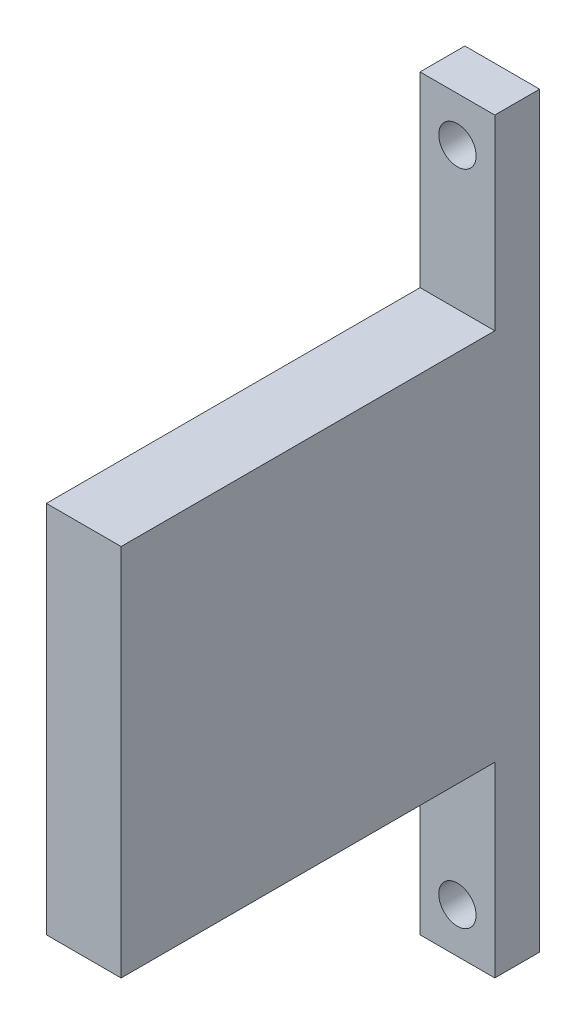
ISO-10303-21;
HEADER;
FILE_DESCRIPTION(('STEP AP214'),'2;1');
FILE_NAME('part.step','',(''),(''),'','','');
FILE_SCHEMA(('AUTOMOTIVE_DESIGN { 1 0 10303 214 1 1 1 1 }'));
ENDSEC;
DATA;
#1=APPLICATION_CONTEXT('core data for automotive mechanical design processes');
#2=APPLICATION_PROTOCOL_DEFINITION('international standard','automotive_design',2000,#1);
#3=PRODUCT_CONTEXT('',#1,'mechanical');
#4=PRODUCT('Part','Part','',(#3));
#5=PRODUCT_RELATED_PRODUCT_CATEGORY('part','',(#4));
#6=PRODUCT_DEFINITION_FORMATION('','',#4);
#7=PRODUCT_DEFINITION_CONTEXT('part definition',#1,'design');
#8=PRODUCT_DEFINITION('design','',#6,#7);
#9=PRODUCT_DEFINITION_SHAPE('','',#8);
#10=(LENGTH_UNIT() NAMED_UNIT(*) SI_UNIT(.MILLI.,.METRE.));
#11=(NAMED_UNIT(*) PLANE_ANGLE_UNIT() SI_UNIT($,.RADIAN.));
#12=(NAMED_UNIT(*) SI_UNIT($,.STERADIAN.) SOLID_ANGLE_UNIT());
#13=UNCERTAINTY_MEASURE_WITH_UNIT(LENGTH_MEASURE(1.E-05),#10,'distance_accuracy_value','');
#14=(GEOMETRIC_REPRESENTATION_CONTEXT(3) GLOBAL_UNCERTAINTY_ASSIGNED_CONTEXT((#13)) GLOBAL_UNIT_ASSIGNED_CONTEXT((#10,
#11,#12)) REPRESENTATION_CONTEXT('',''));
#15=CARTESIAN_POINT('',(0.,0.,0.));
#16=DIRECTION('',(0.,0.,1.));
#17=DIRECTION('',(1.,0.,0.));
#18=AXIS2_PLACEMENT_3D('',#15,#16,#17);
#19=CARTESIAN_POINT('',(5.,0.,0.));
#20=DIRECTION('',(0.,0.,-1.));
#21=DIRECTION('',(-1.,0.,0.));
#22=AXIS2_PLACEMENT_3D('',#19,#20,#21);
#23=PLANE('',#22);
#24=DIRECTION('',(0.,-1.,0.));
#25=VECTOR('',#24,1.);
#26=CARTESIAN_POINT('',(0.,0.,0.));
#27=LINE('',#26,#25);
#28=CARTESIAN_POINT('',(0.,25.,0.));
#29=VERTEX_POINT('',#28);
#30=CARTESIAN_POINT('',(0.,0.,0.));
#31=VERTEX_POINT('',#30);
#32=EDGE_CURVE('E148',#29,#31,#27,.T.);
#33=ORIENTED_EDGE('',*,*,#32,.T.);
#34=DIRECTION('',(-1.,0.,0.));
#35=VECTOR('',#34,1.);
#36=CARTESIAN_POINT('',(5.,0.,0.));
#37=LINE('',#36,#35);
#38=CARTESIAN_POINT('',(5.,0.,0.));
#39=VERTEX_POINT('',#38);
#40=EDGE_CURVE('E176',#39,#31,#37,.T.);
#41=ORIENTED_EDGE('',*,*,#40,.F.);
#42=DIRECTION('',(0.,-1.,0.));
#43=VECTOR('',#42,1.);
#44=CARTESIAN_POINT('',(5.,0.,0.));
#45=LINE('',#44,#43);
#46=CARTESIAN_POINT('',(5.,25.,0.));
#47=VERTEX_POINT('',#46);
#48=EDGE_CURVE('E163',#47,#39,#45,.T.);
#49=ORIENTED_EDGE('',*,*,#48,.F.);
#50=DIRECTION('',(-1.,0.,0.));
#51=VECTOR('',#50,1.);
#52=CARTESIAN_POINT('',(5.,25.,0.));
#53=LINE('',#52,#51);
#54=EDGE_CURVE('E144',#47,#29,#53,.T.);
#55=ORIENTED_EDGE('',*,*,#54,.T.);
#56=EDGE_LOOP('',(#33,#41,#49,#55));
#57=FACE_BOUND('',#56,.T.);
#58=ADVANCED_FACE('F49',(#57),#23,.F.);
#59=CARTESIAN_POINT('',(5.,0.,0.));
#60=DIRECTION('',(0.,1.,0.));
#61=DIRECTION('',(0.,0.,1.));
#62=AXIS2_PLACEMENT_3D('',#59,#60,#61);
#63=PLANE('',#62);
#64=DIRECTION('',(0.,0.,-1.));
#65=VECTOR('',#64,1.);
#66=CARTESIAN_POINT('',(0.,0.,0.));
#67=LINE('',#66,#65);
#68=CARTESIAN_POINT('',(0.,0.,-25.));
#69=VERTEX_POINT('',#68);
#70=EDGE_CURVE('E151',#31,#69,#67,.T.);
#71=ORIENTED_EDGE('',*,*,#70,.T.);
#72=DIRECTION('',(-1.,0.,0.));
#73=VECTOR('',#72,1.);
#74=CARTESIAN_POINT('',(5.,0.,-25.));
#75=LINE('',#74,#73);
#76=CARTESIAN_POINT('',(5.,0.,-25.));
#77=VERTEX_POINT('',#76);
#78=EDGE_CURVE('E173',#77,#69,#75,.T.);
#79=ORIENTED_EDGE('',*,*,#78,.F.);
#80=DIRECTION('',(0.,0.,-1.));
#81=VECTOR('',#80,1.);
#82=CARTESIAN_POINT('',(5.,0.,0.));
#83=LINE('',#82,#81);
#84=EDGE_CURVE('E111',#39,#77,#83,.T.);
#85=ORIENTED_EDGE('',*,*,#84,.F.);
#86=ORIENTED_EDGE('',*,*,#40,.T.);
#87=EDGE_LOOP('',(#71,#79,#85,#86));
#88=FACE_BOUND('',#87,.T.);
#89=ADVANCED_FACE('F197',(#88),#63,.F.);
#90=CARTESIAN_POINT('',(5.,-12.5,-25.));
#91=DIRECTION('',(0.,0.,-1.));
#92=DIRECTION('',(-1.,0.,0.));
#93=AXIS2_PLACEMENT_3D('',#90,#91,#92);
#94=PLANE('',#93);
#95=CARTESIAN_POINT('',(2.5,-9.5,-25.));
#96=DIRECTION('',(0.,0.,1.));
#97=DIRECTION('',(-1.,0.,0.));
#98=AXIS2_PLACEMENT_3D('',#95,#96,#97);
#99=CIRCLE('',#98,1.25);
#100=CARTESIAN_POINT('',(1.25,-9.5,-25.));
#101=VERTEX_POINT('',#100);
#102=EDGE_CURVE('E327',#101,#101,#99,.T.);
#103=ORIENTED_EDGE('',*,*,#102,.F.);
#104=EDGE_LOOP('',(#103));
#105=FACE_BOUND('',#104,.T.);
#106=DIRECTION('',(0.,-1.,0.));
#107=VECTOR('',#106,1.);
#108=CARTESIAN_POINT('',(0.,-12.5,-25.));
#109=LINE('',#108,#107);
#110=CARTESIAN_POINT('',(0.,-12.5,-25.));
#111=VERTEX_POINT('',#110);
#112=EDGE_CURVE('E154',#69,#111,#109,.T.);
#113=ORIENTED_EDGE('',*,*,#112,.T.);
#114=DIRECTION('',(-1.,0.,0.));
#115=VECTOR('',#114,1.);
#116=CARTESIAN_POINT('',(5.,-12.5,-25.));
#117=LINE('',#116,#115);
#118=CARTESIAN_POINT('',(5.,-12.5,-25.));
#119=VERTEX_POINT('',#118);
#120=EDGE_CURVE('E170',#119,#111,#117,.T.);
#121=ORIENTED_EDGE('',*,*,#120,.F.);
#122=DIRECTION('',(0.,-1.,0.));
#123=VECTOR('',#122,1.);
#124=CARTESIAN_POINT('',(5.,-12.5,-25.));
#125=LINE('',#124,#123);
#126=EDGE_CURVE('E333',#77,#119,#125,.T.);
#127=ORIENTED_EDGE('',*,*,#126,.F.);
#128=ORIENTED_EDGE('',*,*,#78,.T.);
#129=EDGE_LOOP('',(#113,#121,#127,#128));
#130=FACE_BOUND('',#129,.T.);
#131=ADVANCED_FACE('F202',(#105,#130),#94,.F.);
#132=CARTESIAN_POINT('',(5.,-12.5,-25.));
#133=DIRECTION('',(0.,1.,0.));
#134=DIRECTION('',(0.,0.,1.));
#135=AXIS2_PLACEMENT_3D('',#132,#133,#134);
#136=PLANE('',#135);
#137=DIRECTION('',(0.,0.,-1.));
#138=VECTOR('',#137,1.);
#139=CARTESIAN_POINT('',(0.,-12.5,-25.));
#140=LINE('',#139,#138);
#141=CARTESIAN_POINT('',(0.,-12.5,-28.));
#142=VERTEX_POINT('',#141);
#143=EDGE_CURVE('E156',#111,#142,#140,.T.);
#144=ORIENTED_EDGE('',*,*,#143,.T.);
#145=DIRECTION('',(-1.,0.,0.));
#146=VECTOR('',#145,1.);
#147=CARTESIAN_POINT('',(5.,-12.5,-28.));
#148=LINE('',#147,#146);
#149=CARTESIAN_POINT('',(5.,-12.5,-28.));
#150=VERTEX_POINT('',#149);
#151=EDGE_CURVE('E167',#150,#142,#148,.T.);
#152=ORIENTED_EDGE('',*,*,#151,.F.);
#153=DIRECTION('',(0.,0.,-1.));
#154=VECTOR('',#153,1.);
#155=CARTESIAN_POINT('',(5.,-12.5,-25.));
#156=LINE('',#155,#154);
#157=EDGE_CURVE('E335',#119,#150,#156,.T.);
#158=ORIENTED_EDGE('',*,*,#157,.F.);
#159=ORIENTED_EDGE('',*,*,#120,.T.);
#160=EDGE_LOOP('',(#144,#152,#158,#159));
#161=FACE_BOUND('',#160,.T.);
#162=ADVANCED_FACE('F207',(#161),#136,.F.);
#163=CARTESIAN_POINT('',(5.,-12.5,-28.));
#164=DIRECTION('',(0.,0.,1.));
#165=DIRECTION('',(1.,0.,0.));
#166=AXIS2_PLACEMENT_3D('',#163,#164,#165);
#167=PLANE('',#166);
#168=CARTESIAN_POINT('',(2.5,34.5,-28.));
#169=DIRECTION('',(0.,0.,1.));
#170=DIRECTION('',(1.,0.,0.));
#171=AXIS2_PLACEMENT_3D('',#168,#169,#170);
#172=CIRCLE('',#171,1.25);
#173=CARTESIAN_POINT('',(3.75,34.5,-28.));
#174=VERTEX_POINT('',#173);
#175=EDGE_CURVE('E179',#174,#174,#172,.T.);
#176=ORIENTED_EDGE('',*,*,#175,.T.);
#177=EDGE_LOOP('',(#176));
#178=FACE_BOUND('',#177,.T.);
#179=CARTESIAN_POINT('',(2.5,-9.5,-28.));
#180=DIRECTION('',(0.,0.,1.));
#181=DIRECTION('',(1.,0.,0.));
#182=AXIS2_PLACEMENT_3D('',#179,#180,#181);
#183=CIRCLE('',#182,1.25);
#184=CARTESIAN_POINT('',(3.75,-9.5,-28.));
#185=VERTEX_POINT('',#184);
#186=EDGE_CURVE('E152',#185,#185,#183,.T.);
#187=ORIENTED_EDGE('',*,*,#186,.T.);
#188=EDGE_LOOP('',(#187));
#189=FACE_BOUND('',#188,.T.);
#190=DIRECTION('',(0.,1.,0.));
#191=VECTOR('',#190,1.);
#192=CARTESIAN_POINT('',(0.,-12.5,-28.));
#193=LINE('',#192,#191);
#194=CARTESIAN_POINT('',(0.,37.5,-28.));
#195=VERTEX_POINT('',#194);
#196=EDGE_CURVE('E158',#142,#195,#193,.T.);
#197=ORIENTED_EDGE('',*,*,#196,.T.);
#198=DIRECTION('',(-1.,0.,0.));
#199=VECTOR('',#198,1.);
#200=CARTESIAN_POINT('',(5.,37.5,-28.));
#201=LINE('',#200,#199);
#202=CARTESIAN_POINT('',(5.,37.5,-28.));
#203=VERTEX_POINT('',#202);
#204=EDGE_CURVE('E139',#203,#195,#201,.T.);
#205=ORIENTED_EDGE('',*,*,#204,.F.);
#206=DIRECTION('',(0.,1.,0.));
#207=VECTOR('',#206,1.);
#208=CARTESIAN_POINT('',(5.,-12.5,-28.));
#209=LINE('',#208,#207);
#210=EDGE_CURVE('E130',#150,#203,#209,.T.);
#211=ORIENTED_EDGE('',*,*,#210,.F.);
#212=ORIENTED_EDGE('',*,*,#151,.T.);
#213=EDGE_LOOP('',(#197,#205,#211,#212));
#214=FACE_BOUND('',#213,.T.);
#215=ADVANCED_FACE('F211',(#178,#189,#214),#167,.F.);
#216=CARTESIAN_POINT('',(5.,37.5,-25.));
#217=DIRECTION('',(0.,-1.,0.));
#218=DIRECTION('',(0.,0.,-1.));
#219=AXIS2_PLACEMENT_3D('',#216,#217,#218);
#220=PLANE('',#219);
#221=DIRECTION('',(0.,0.,1.));
#222=VECTOR('',#221,1.);
#223=CARTESIAN_POINT('',(0.,37.5,-25.));
#224=LINE('',#223,#222);
#225=CARTESIAN_POINT('',(0.,37.5,-25.));
#226=VERTEX_POINT('',#225);
#227=EDGE_CURVE('E138',#195,#226,#224,.T.);
#228=ORIENTED_EDGE('',*,*,#227,.T.);
#229=DIRECTION('',(-1.,0.,0.));
#230=VECTOR('',#229,1.);
#231=CARTESIAN_POINT('',(5.,37.5,-25.));
#232=LINE('',#231,#230);
#233=CARTESIAN_POINT('',(5.,37.5,-25.));
#234=VERTEX_POINT('',#233);
#235=EDGE_CURVE('E135',#234,#226,#232,.T.);
#236=ORIENTED_EDGE('',*,*,#235,.F.);
#237=DIRECTION('',(0.,0.,1.));
#238=VECTOR('',#237,1.);
#239=CARTESIAN_POINT('',(5.,37.5,-25.));
#240=LINE('',#239,#238);
#241=EDGE_CURVE('E124',#203,#234,#240,.T.);
#242=ORIENTED_EDGE('',*,*,#241,.F.);
#243=ORIENTED_EDGE('',*,*,#204,.T.);
#244=EDGE_LOOP('',(#228,#236,#242,#243));
#245=FACE_BOUND('',#244,.T.);
#246=ADVANCED_FACE('F136',(#245),#220,.F.);
#247=CARTESIAN_POINT('',(5.,25.,-25.));
#248=DIRECTION('',(0.,0.,-1.));
#249=DIRECTION('',(-1.,0.,0.));
#250=AXIS2_PLACEMENT_3D('',#247,#248,#249);
#251=PLANE('',#250);
#252=CARTESIAN_POINT('',(2.5,34.5,-25.));
#253=DIRECTION('',(0.,0.,1.));
#254=DIRECTION('',(1.,0.,0.));
#255=AXIS2_PLACEMENT_3D('',#252,#253,#254);
#256=CIRCLE('',#255,1.25);
#257=CARTESIAN_POINT('',(3.75,34.5,-25.));
#258=VERTEX_POINT('',#257);
#259=EDGE_CURVE('E323',#258,#258,#256,.T.);
#260=ORIENTED_EDGE('',*,*,#259,.F.);
#261=EDGE_LOOP('',(#260));
#262=FACE_BOUND('',#261,.T.);
#263=DIRECTION('',(0.,-1.,0.));
#264=VECTOR('',#263,1.);
#265=CARTESIAN_POINT('',(0.,25.,-25.));
#266=LINE('',#265,#264);
#267=CARTESIAN_POINT('',(0.,25.,-25.));
#268=VERTEX_POINT('',#267);
#269=EDGE_CURVE('E96',#226,#268,#266,.T.);
#270=ORIENTED_EDGE('',*,*,#269,.T.);
#271=DIRECTION('',(-1.,0.,0.));
#272=VECTOR('',#271,1.);
#273=CARTESIAN_POINT('',(5.,25.,-25.));
#274=LINE('',#273,#272);
#275=CARTESIAN_POINT('',(5.,25.,-25.));
#276=VERTEX_POINT('',#275);
#277=EDGE_CURVE('E140',#276,#268,#274,.T.);
#278=ORIENTED_EDGE('',*,*,#277,.F.);
#279=DIRECTION('',(0.,-1.,0.));
#280=VECTOR('',#279,1.);
#281=CARTESIAN_POINT('',(5.,25.,-25.));
#282=LINE('',#281,#280);
#283=EDGE_CURVE('E128',#234,#276,#282,.T.);
#284=ORIENTED_EDGE('',*,*,#283,.F.);
#285=ORIENTED_EDGE('',*,*,#235,.T.);
#286=EDGE_LOOP('',(#270,#278,#284,#285));
#287=FACE_BOUND('',#286,.T.);
#288=ADVANCED_FACE('F142',(#262,#287),#251,.F.);
#289=CARTESIAN_POINT('',(5.,25.,0.));
#290=DIRECTION('',(0.,-1.,0.));
#291=DIRECTION('',(0.,0.,-1.));
#292=AXIS2_PLACEMENT_3D('',#289,#290,#291);
#293=PLANE('',#292);
#294=DIRECTION('',(0.,0.,1.));
#295=VECTOR('',#294,1.);
#296=CARTESIAN_POINT('',(0.,25.,0.));
#297=LINE('',#296,#295);
#298=EDGE_CURVE('E102',#268,#29,#297,.T.);
#299=ORIENTED_EDGE('',*,*,#298,.T.);
#300=ORIENTED_EDGE('',*,*,#54,.F.);
#301=DIRECTION('',(0.,0.,1.));
#302=VECTOR('',#301,1.);
#303=CARTESIAN_POINT('',(5.,25.,0.));
#304=LINE('',#303,#302);
#305=EDGE_CURVE('E67',#276,#47,#304,.T.);
#306=ORIENTED_EDGE('',*,*,#305,.F.);
#307=ORIENTED_EDGE('',*,*,#277,.T.);
#308=EDGE_LOOP('',(#299,#300,#306,#307));
#309=FACE_BOUND('',#308,.T.);
#310=ADVANCED_FACE('F220',(#309),#293,.F.);
#311=CARTESIAN_POINT('',(5.,0.,0.));
#312=DIRECTION('',(-1.,0.,0.));
#313=DIRECTION('',(0.,0.,1.));
#314=AXIS2_PLACEMENT_3D('',#311,#312,#313);
#315=PLANE('',#314);
#316=ORIENTED_EDGE('',*,*,#48,.T.);
#317=ORIENTED_EDGE('',*,*,#84,.T.);
#318=ORIENTED_EDGE('',*,*,#126,.T.);
#319=ORIENTED_EDGE('',*,*,#157,.T.);
#320=ORIENTED_EDGE('',*,*,#210,.T.);
#321=ORIENTED_EDGE('',*,*,#241,.T.);
#322=ORIENTED_EDGE('',*,*,#283,.T.);
#323=ORIENTED_EDGE('',*,*,#305,.T.);
#324=EDGE_LOOP('',(#316,#317,#318,#319,#320,#321,#322,#323));
#325=FACE_BOUND('',#324,.T.);
#326=ADVANCED_FACE('F126',(#325),#315,.F.);
#327=CARTESIAN_POINT('',(0.,0.,0.));
#328=DIRECTION('',(-1.,0.,0.));
#329=DIRECTION('',(0.,0.,1.));
#330=AXIS2_PLACEMENT_3D('',#327,#328,#329);
#331=PLANE('',#330);
#332=CARTESIAN_POINT('',(0.,12.5,-8.));
#333=DIRECTION('',(-1.,0.,0.));
#334=DIRECTION('',(0.,0.,1.));
#335=AXIS2_PLACEMENT_3D('',#332,#333,#334);
#336=CIRCLE('',#335,5.55000000000001);
#337=CARTESIAN_POINT('',(0.,12.5,-2.44999999999999));
#338=VERTEX_POINT('',#337);
#339=EDGE_CURVE('E11',#338,#338,#336,.F.);
#340=ORIENTED_EDGE('',*,*,#339,.T.);
#341=EDGE_LOOP('',(#340));
#342=FACE_BOUND('',#341,.T.);
#343=ORIENTED_EDGE('',*,*,#32,.F.);
#344=ORIENTED_EDGE('',*,*,#298,.F.);
#345=ORIENTED_EDGE('',*,*,#269,.F.);
#346=ORIENTED_EDGE('',*,*,#227,.F.);
#347=ORIENTED_EDGE('',*,*,#196,.F.);
#348=ORIENTED_EDGE('',*,*,#143,.F.);
#349=ORIENTED_EDGE('',*,*,#112,.F.);
#350=ORIENTED_EDGE('',*,*,#70,.F.);
#351=EDGE_LOOP('',(#343,#344,#345,#346,#347,#348,#349,#350));
#352=FACE_BOUND('',#351,.T.);
#353=ADVANCED_FACE('F224',(#342,#352),#331,.T.);
#354=CARTESIAN_POINT('',(2.5,34.5,-29.));
#355=DIRECTION('',(0.,0.,1.));
#356=DIRECTION('',(1.,0.,0.));
#357=AXIS2_PLACEMENT_3D('',#354,#355,#356);
#358=CYLINDRICAL_SURFACE('',#357,1.25);
#359=ORIENTED_EDGE('',*,*,#259,.T.);
#360=EDGE_LOOP('',(#359));
#361=FACE_BOUND('',#360,.T.);
#362=ORIENTED_EDGE('',*,*,#175,.F.);
#363=EDGE_LOOP('',(#362));
#364=FACE_BOUND('',#363,.T.);
#365=ADVANCED_FACE('F227',(#361,#364),#358,.F.);
#366=CARTESIAN_POINT('',(2.5,-9.5,-29.));
#367=DIRECTION('',(0.,0.,1.));
#368=DIRECTION('',(1.,0.,0.));
#369=AXIS2_PLACEMENT_3D('',#366,#367,#368);
#370=CYLINDRICAL_SURFACE('',#369,1.25);
#371=ORIENTED_EDGE('',*,*,#102,.T.);
#372=EDGE_LOOP('',(#371));
#373=FACE_BOUND('',#372,.T.);
#374=ORIENTED_EDGE('',*,*,#186,.F.);
#375=EDGE_LOOP('',(#374));
#376=FACE_BOUND('',#375,.T.);
#377=ADVANCED_FACE('F231',(#373,#376),#370,.F.);
#378=CARTESIAN_POINT('',(3.,12.5,-8.));
#379=DIRECTION('',(-1.,0.,0.));
#380=DIRECTION('',(0.,0.,1.));
#381=AXIS2_PLACEMENT_3D('',#378,#379,#380);
#382=CYLINDRICAL_SURFACE('',#381,5.05);
#383=CARTESIAN_POINT('',(0.500000000000016,12.5,-8.));
#384=DIRECTION('',(-1.,0.,0.));
#385=DIRECTION('',(0.,0.,1.));
#386=AXIS2_PLACEMENT_3D('',#383,#384,#385);
#387=CIRCLE('',#386,5.05);
#388=CARTESIAN_POINT('',(0.500000000000016,12.5,-2.95));
#389=VERTEX_POINT('',#388);
#390=EDGE_CURVE('E59',#389,#389,#387,.T.);
#391=ORIENTED_EDGE('',*,*,#390,.T.);
#392=EDGE_LOOP('',(#391));
#393=FACE_BOUND('',#392,.T.);
#394=CARTESIAN_POINT('',(3.,12.5,-8.));
#395=DIRECTION('',(-1.,0.,0.));
#396=DIRECTION('',(0.,0.,1.));
#397=AXIS2_PLACEMENT_3D('',#394,#395,#396);
#398=CIRCLE('',#397,5.05);
#399=CARTESIAN_POINT('',(3.,12.5,-2.95));
#400=VERTEX_POINT('',#399);
#401=EDGE_CURVE('E350',#400,#400,#398,.T.);
#402=ORIENTED_EDGE('',*,*,#401,.F.);
#403=EDGE_LOOP('',(#402));
#404=FACE_BOUND('',#403,.T.);
#405=ADVANCED_FACE('F183',(#393,#404),#382,.F.);
#406=CARTESIAN_POINT('',(3.,12.5,-8.));
#407=DIRECTION('',(-1.,0.,0.));
#408=DIRECTION('',(0.,0.,1.));
#409=AXIS2_PLACEMENT_3D('',#406,#407,#408);
#410=PLANE('',#409);
#411=ORIENTED_EDGE('',*,*,#401,.T.);
#412=EDGE_LOOP('',(#411));
#413=FACE_BOUND('',#412,.T.);
#414=ADVANCED_FACE('F187',(#413),#410,.T.);
#415=CARTESIAN_POINT('',(0.500000000000016,12.5,-8.));
#416=DIRECTION('',(-1.,0.,0.));
#417=DIRECTION('',(0.,0.,1.));
#418=AXIS2_PLACEMENT_3D('',#415,#416,#417);
#419=CONICAL_SURFACE('',#418,5.05,0.785398163397445);
#420=ORIENTED_EDGE('',*,*,#339,.F.);
#421=EDGE_LOOP('',(#420));
#422=FACE_BOUND('',#421,.T.);
#423=ORIENTED_EDGE('',*,*,#390,.F.);
#424=EDGE_LOOP('',(#423));
#425=FACE_BOUND('',#424,.T.);
#426=ADVANCED_FACE('F52',(#422,#425),#419,.F.);
#427=CLOSED_SHELL('',(#58,#89,#131,#162,#215,#246,#288,#310,#326,#353,#365,#377,#405,#414,#426));
#428=MANIFOLD_SOLID_BREP('B2',#427);
#429=ADVANCED_BREP_SHAPE_REPRESENTATION('',(#18,#428),#14);
#430=SHAPE_DEFINITION_REPRESENTATION(#9,#429);
ENDSEC;
END-ISO-10303-21;
